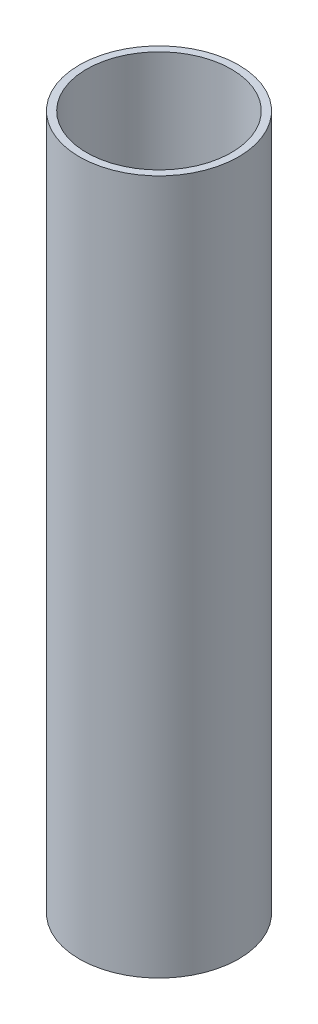
ISO-10303-21;
HEADER;
FILE_DESCRIPTION(('STEP AP214'),'2;1');
FILE_NAME('part.step','',(''),(''),'','','');
FILE_SCHEMA(('AUTOMOTIVE_DESIGN { 1 0 10303 214 1 1 1 1 }'));
ENDSEC;
DATA;
#1=APPLICATION_CONTEXT('core data for automotive mechanical design processes');
#2=APPLICATION_PROTOCOL_DEFINITION('international standard','automotive_design',2000,#1);
#3=PRODUCT_CONTEXT('',#1,'mechanical');
#4=PRODUCT('Part','Part','',(#3));
#5=PRODUCT_RELATED_PRODUCT_CATEGORY('part','',(#4));
#6=PRODUCT_DEFINITION_FORMATION('','',#4);
#7=PRODUCT_DEFINITION_CONTEXT('part definition',#1,'design');
#8=PRODUCT_DEFINITION('design','',#6,#7);
#9=PRODUCT_DEFINITION_SHAPE('','',#8);
#10=(LENGTH_UNIT() NAMED_UNIT(*) SI_UNIT(.MILLI.,.METRE.));
#11=(NAMED_UNIT(*) PLANE_ANGLE_UNIT() SI_UNIT($,.RADIAN.));
#12=(NAMED_UNIT(*) SI_UNIT($,.STERADIAN.) SOLID_ANGLE_UNIT());
#13=UNCERTAINTY_MEASURE_WITH_UNIT(LENGTH_MEASURE(1.E-05),#10,'distance_accuracy_value','');
#14=(GEOMETRIC_REPRESENTATION_CONTEXT(3) GLOBAL_UNCERTAINTY_ASSIGNED_CONTEXT((#13)) GLOBAL_UNIT_ASSIGNED_CONTEXT((#10,
#11,#12)) REPRESENTATION_CONTEXT('',''));
#15=CARTESIAN_POINT('',(0.,0.,0.));
#16=DIRECTION('',(0.,0.,1.));
#17=DIRECTION('',(1.,0.,0.));
#18=AXIS2_PLACEMENT_3D('',#15,#16,#17);
#19=CARTESIAN_POINT('',(0.,152.4,0.));
#20=DIRECTION('',(0.,1.,0.));
#21=DIRECTION('',(0.,0.,1.));
#22=AXIS2_PLACEMENT_3D('',#19,#20,#21);
#23=PLANE('',#22);
#24=CARTESIAN_POINT('',(0.,152.4,0.));
#25=DIRECTION('',(0.,1.,0.));
#26=DIRECTION('',(0.,0.,1.));
#27=AXIS2_PLACEMENT_3D('',#24,#25,#26);
#28=CIRCLE('',#27,17.4625);
#29=CARTESIAN_POINT('',(0.,152.4,-17.4625));
#30=VERTEX_POINT('',#29);
#31=EDGE_CURVE('E10',#30,#30,#28,.T.);
#32=ORIENTED_EDGE('',*,*,#31,.T.);
#33=EDGE_LOOP('',(#32));
#34=FACE_BOUND('',#33,.T.);
#35=CARTESIAN_POINT('',(0.,152.4,0.));
#36=DIRECTION('',(0.,1.,0.));
#37=DIRECTION('',(0.,0.,1.));
#38=AXIS2_PLACEMENT_3D('',#35,#36,#37);
#39=CIRCLE('',#38,15.875);
#40=CARTESIAN_POINT('',(0.,152.4,-15.875));
#41=VERTEX_POINT('',#40);
#42=EDGE_CURVE('E43',#41,#41,#39,.T.);
#43=ORIENTED_EDGE('',*,*,#42,.F.);
#44=EDGE_LOOP('',(#43));
#45=FACE_BOUND('',#44,.T.);
#46=ADVANCED_FACE('F32',(#34,#45),#23,.T.);
#47=CARTESIAN_POINT('',(0.,0.,0.));
#48=DIRECTION('',(0.,1.,0.));
#49=DIRECTION('',(0.,0.,1.));
#50=AXIS2_PLACEMENT_3D('',#47,#48,#49);
#51=PLANE('',#50);
#52=CARTESIAN_POINT('',(0.,0.,0.));
#53=DIRECTION('',(0.,1.,0.));
#54=DIRECTION('',(0.,0.,1.));
#55=AXIS2_PLACEMENT_3D('',#52,#53,#54);
#56=CIRCLE('',#55,17.4625);
#57=CARTESIAN_POINT('',(0.,0.,-17.4625));
#58=VERTEX_POINT('',#57);
#59=EDGE_CURVE('E36',#58,#58,#56,.T.);
#60=ORIENTED_EDGE('',*,*,#59,.F.);
#61=EDGE_LOOP('',(#60));
#62=FACE_BOUND('',#61,.T.);
#63=CARTESIAN_POINT('',(0.,0.,0.));
#64=DIRECTION('',(0.,1.,0.));
#65=DIRECTION('',(0.,0.,1.));
#66=AXIS2_PLACEMENT_3D('',#63,#64,#65);
#67=CIRCLE('',#66,15.875);
#68=CARTESIAN_POINT('',(0.,0.,-15.875));
#69=VERTEX_POINT('',#68);
#70=EDGE_CURVE('E45',#69,#69,#67,.T.);
#71=ORIENTED_EDGE('',*,*,#70,.T.);
#72=EDGE_LOOP('',(#71));
#73=FACE_BOUND('',#72,.T.);
#74=ADVANCED_FACE('F55',(#62,#73),#51,.F.);
#75=CARTESIAN_POINT('',(0.,152.4,0.));
#76=DIRECTION('',(0.,-1.,0.));
#77=DIRECTION('',(0.,0.,-1.));
#78=AXIS2_PLACEMENT_3D('',#75,#76,#77);
#79=CYLINDRICAL_SURFACE('',#78,17.4625);
#80=CARTESIAN_POINT('',(0.,152.4,-17.4625));
#81=CARTESIAN_POINT('',(0.,150.8125,-17.4625));
#82=CARTESIAN_POINT('',(0.,149.225,-17.4625));
#83=CARTESIAN_POINT('',(0.,146.05,-17.4625));
#84=CARTESIAN_POINT('',(0.,144.4625,-17.4625));
#85=CARTESIAN_POINT('',(0.,141.2875,-17.4625));
#86=CARTESIAN_POINT('',(0.,139.7,-17.4625));
#87=CARTESIAN_POINT('',(0.,136.525,-17.4625));
#88=CARTESIAN_POINT('',(0.,134.9375,-17.4625));
#89=CARTESIAN_POINT('',(0.,131.7625,-17.4625));
#90=CARTESIAN_POINT('',(0.,130.175,-17.4625));
#91=CARTESIAN_POINT('',(0.,127.,-17.4625));
#92=CARTESIAN_POINT('',(0.,125.4125,-17.4625));
#93=CARTESIAN_POINT('',(0.,122.2375,-17.4625));
#94=CARTESIAN_POINT('',(0.,120.65,-17.4625));
#95=CARTESIAN_POINT('',(0.,117.475,-17.4625));
#96=CARTESIAN_POINT('',(0.,115.8875,-17.4625));
#97=CARTESIAN_POINT('',(0.,112.7125,-17.4625));
#98=CARTESIAN_POINT('',(0.,111.125,-17.4625));
#99=CARTESIAN_POINT('',(0.,107.95,-17.4625));
#100=CARTESIAN_POINT('',(0.,106.3625,-17.4625));
#101=CARTESIAN_POINT('',(0.,103.1875,-17.4625));
#102=CARTESIAN_POINT('',(0.,101.6,-17.4625));
#103=CARTESIAN_POINT('',(0.,98.425,-17.4625));
#104=CARTESIAN_POINT('',(0.,96.8375,-17.4625));
#105=CARTESIAN_POINT('',(0.,93.6625,-17.4625));
#106=CARTESIAN_POINT('',(0.,92.075,-17.4625));
#107=CARTESIAN_POINT('',(0.,88.9,-17.4625));
#108=CARTESIAN_POINT('',(0.,87.3125,-17.4625));
#109=CARTESIAN_POINT('',(0.,84.1375,-17.4625));
#110=CARTESIAN_POINT('',(0.,82.55,-17.4625));
#111=CARTESIAN_POINT('',(0.,79.375,-17.4625));
#112=CARTESIAN_POINT('',(0.,77.7875,-17.4625));
#113=CARTESIAN_POINT('',(0.,74.6125,-17.4625));
#114=CARTESIAN_POINT('',(0.,73.025,-17.4625));
#115=CARTESIAN_POINT('',(0.,69.85,-17.4625));
#116=CARTESIAN_POINT('',(0.,68.2625,-17.4625));
#117=CARTESIAN_POINT('',(0.,65.0875,-17.4625));
#118=CARTESIAN_POINT('',(0.,63.5,-17.4625));
#119=CARTESIAN_POINT('',(0.,60.325,-17.4625));
#120=CARTESIAN_POINT('',(0.,58.7375,-17.4625));
#121=CARTESIAN_POINT('',(0.,55.5625,-17.4625));
#122=CARTESIAN_POINT('',(0.,53.975,-17.4625));
#123=CARTESIAN_POINT('',(0.,50.8,-17.4625));
#124=CARTESIAN_POINT('',(0.,49.2125,-17.4625));
#125=CARTESIAN_POINT('',(0.,46.0375,-17.4625));
#126=CARTESIAN_POINT('',(0.,44.45,-17.4625));
#127=CARTESIAN_POINT('',(0.,41.275,-17.4625));
#128=CARTESIAN_POINT('',(0.,39.6875,-17.4625));
#129=CARTESIAN_POINT('',(0.,36.5125,-17.4625));
#130=CARTESIAN_POINT('',(0.,34.925,-17.4625));
#131=CARTESIAN_POINT('',(0.,31.75,-17.4625));
#132=CARTESIAN_POINT('',(0.,30.1625,-17.4625));
#133=CARTESIAN_POINT('',(0.,26.9875,-17.4625));
#134=CARTESIAN_POINT('',(0.,25.4,-17.4625));
#135=CARTESIAN_POINT('',(0.,22.225,-17.4625));
#136=CARTESIAN_POINT('',(0.,20.6375,-17.4625));
#137=CARTESIAN_POINT('',(0.,17.4625,-17.4625));
#138=CARTESIAN_POINT('',(0.,15.875,-17.4625));
#139=CARTESIAN_POINT('',(0.,12.7,-17.4625));
#140=CARTESIAN_POINT('',(0.,11.1125,-17.4625));
#141=CARTESIAN_POINT('',(0.,7.93750000000001,-17.4625));
#142=CARTESIAN_POINT('',(0.,6.35,-17.4625));
#143=CARTESIAN_POINT('',(0.,3.175,-17.4625));
#144=CARTESIAN_POINT('',(0.,1.5875,-17.4625));
#145=CARTESIAN_POINT('',(0.,0.,-17.4625));
#146=B_SPLINE_CURVE_WITH_KNOTS('',3,(#80,#81,#82,#83,#84,#85,#86,#87,#88,#89,#90,#91,#92,#93,
#94,#95,#96,#97,#98,#99,#100,#101,#102,#103,#104,#105,#106,#107,#108,#109,#110,#111,#112,#113,
#114,#115,#116,#117,#118,#119,#120,#121,#122,#123,#124,#125,#126,#127,#128,#129,#130,#131,#132,
#133,#134,#135,#136,#137,#138,#139,#140,#141,#142,#143,#144,#145),.UNSPECIFIED.,.F.,.F.,(4,2,2,
2,2,2,2,2,2,2,2,2,2,2,2,2,2,2,2,2,2,2,2,2,2,2,2,2,2,2,2,2,4),(0.,4.76249999999998,
9.52499999999998,14.2875,19.05,23.8125,28.575,33.3375,38.1,42.8625,47.625,52.3875,57.15,61.9125,
66.675,71.4375,76.2,80.9625,85.725,90.4875,95.25,100.0125,104.775,109.5375,114.3,119.0625,
123.825,128.5875,133.35,138.1125,142.875,147.6375,152.4),.UNSPECIFIED.);
#147=EDGE_CURVE('BSEAM34',#30,#58,#146,.T.);
#148=ORIENTED_EDGE('',*,*,#31,.F.);
#149=ORIENTED_EDGE('',*,*,#59,.T.);
#150=ORIENTED_EDGE('',*,*,#147,.T.);
#151=ORIENTED_EDGE('',*,*,#147,.F.);
#152=EDGE_LOOP('',(#148,#150,#149,#151));
#153=FACE_BOUND('',#152,.T.);
#154=ADVANCED_FACE('F34',(#153),#79,.T.);
#155=CARTESIAN_POINT('',(0.,152.4,0.));
#156=DIRECTION('',(0.,-1.,0.));
#157=DIRECTION('',(0.,0.,-1.));
#158=AXIS2_PLACEMENT_3D('',#155,#156,#157);
#159=CYLINDRICAL_SURFACE('',#158,15.875);
#160=CARTESIAN_POINT('',(0.,152.4,-15.875));
#161=CARTESIAN_POINT('',(0.,150.8125,-15.875));
#162=CARTESIAN_POINT('',(0.,149.225,-15.875));
#163=CARTESIAN_POINT('',(0.,146.05,-15.875));
#164=CARTESIAN_POINT('',(0.,144.4625,-15.875));
#165=CARTESIAN_POINT('',(0.,141.2875,-15.875));
#166=CARTESIAN_POINT('',(0.,139.7,-15.875));
#167=CARTESIAN_POINT('',(0.,136.525,-15.875));
#168=CARTESIAN_POINT('',(0.,134.9375,-15.875));
#169=CARTESIAN_POINT('',(0.,131.7625,-15.875));
#170=CARTESIAN_POINT('',(0.,130.175,-15.875));
#171=CARTESIAN_POINT('',(0.,127.,-15.875));
#172=CARTESIAN_POINT('',(0.,125.4125,-15.875));
#173=CARTESIAN_POINT('',(0.,122.2375,-15.875));
#174=CARTESIAN_POINT('',(0.,120.65,-15.875));
#175=CARTESIAN_POINT('',(0.,117.475,-15.875));
#176=CARTESIAN_POINT('',(0.,115.8875,-15.875));
#177=CARTESIAN_POINT('',(0.,112.7125,-15.875));
#178=CARTESIAN_POINT('',(0.,111.125,-15.875));
#179=CARTESIAN_POINT('',(0.,107.95,-15.875));
#180=CARTESIAN_POINT('',(0.,106.3625,-15.875));
#181=CARTESIAN_POINT('',(0.,103.1875,-15.875));
#182=CARTESIAN_POINT('',(0.,101.6,-15.875));
#183=CARTESIAN_POINT('',(0.,98.425,-15.875));
#184=CARTESIAN_POINT('',(0.,96.8375,-15.875));
#185=CARTESIAN_POINT('',(0.,93.6625,-15.875));
#186=CARTESIAN_POINT('',(0.,92.075,-15.875));
#187=CARTESIAN_POINT('',(0.,88.9,-15.875));
#188=CARTESIAN_POINT('',(0.,87.3125,-15.875));
#189=CARTESIAN_POINT('',(0.,84.1375,-15.875));
#190=CARTESIAN_POINT('',(0.,82.55,-15.875));
#191=CARTESIAN_POINT('',(0.,79.375,-15.875));
#192=CARTESIAN_POINT('',(0.,77.7875,-15.875));
#193=CARTESIAN_POINT('',(0.,74.6125,-15.875));
#194=CARTESIAN_POINT('',(0.,73.025,-15.875));
#195=CARTESIAN_POINT('',(0.,69.85,-15.875));
#196=CARTESIAN_POINT('',(0.,68.2625,-15.875));
#197=CARTESIAN_POINT('',(0.,65.0875,-15.875));
#198=CARTESIAN_POINT('',(0.,63.5,-15.875));
#199=CARTESIAN_POINT('',(0.,60.325,-15.875));
#200=CARTESIAN_POINT('',(0.,58.7375,-15.875));
#201=CARTESIAN_POINT('',(0.,55.5625,-15.875));
#202=CARTESIAN_POINT('',(0.,53.975,-15.875));
#203=CARTESIAN_POINT('',(0.,50.8,-15.875));
#204=CARTESIAN_POINT('',(0.,49.2125,-15.875));
#205=CARTESIAN_POINT('',(0.,46.0375,-15.875));
#206=CARTESIAN_POINT('',(0.,44.45,-15.875));
#207=CARTESIAN_POINT('',(0.,41.275,-15.875));
#208=CARTESIAN_POINT('',(0.,39.6875,-15.875));
#209=CARTESIAN_POINT('',(0.,36.5125,-15.875));
#210=CARTESIAN_POINT('',(0.,34.925,-15.875));
#211=CARTESIAN_POINT('',(0.,31.75,-15.875));
#212=CARTESIAN_POINT('',(0.,30.1625,-15.875));
#213=CARTESIAN_POINT('',(0.,26.9875,-15.875));
#214=CARTESIAN_POINT('',(0.,25.4,-15.875));
#215=CARTESIAN_POINT('',(0.,22.225,-15.875));
#216=CARTESIAN_POINT('',(0.,20.6375,-15.875));
#217=CARTESIAN_POINT('',(0.,17.4625,-15.875));
#218=CARTESIAN_POINT('',(0.,15.875,-15.875));
#219=CARTESIAN_POINT('',(0.,12.7,-15.875));
#220=CARTESIAN_POINT('',(0.,11.1125,-15.875));
#221=CARTESIAN_POINT('',(0.,7.93750000000001,-15.875));
#222=CARTESIAN_POINT('',(0.,6.35,-15.875));
#223=CARTESIAN_POINT('',(0.,3.175,-15.875));
#224=CARTESIAN_POINT('',(0.,1.5875,-15.875));
#225=CARTESIAN_POINT('',(0.,0.,-15.875));
#226=B_SPLINE_CURVE_WITH_KNOTS('',3,(#160,#161,#162,#163,#164,#165,#166,#167,#168,#169,#170,
#171,#172,#173,#174,#175,#176,#177,#178,#179,#180,#181,#182,#183,#184,#185,#186,#187,#188,#189,
#190,#191,#192,#193,#194,#195,#196,#197,#198,#199,#200,#201,#202,#203,#204,#205,#206,#207,#208,
#209,#210,#211,#212,#213,#214,#215,#216,#217,#218,#219,#220,#221,#222,#223,#224,#225),
.UNSPECIFIED.,.F.,.F.,(4,2,2,2,2,2,2,2,2,2,2,2,2,2,2,2,2,2,2,2,2,2,2,2,2,2,2,2,2,2,2,2,4),(0.,
4.76249999999998,9.52499999999998,14.2875,19.05,23.8125,28.575,33.3375,38.1,42.8625,47.625,
52.3875,57.15,61.9125,66.675,71.4375,76.2,80.9625,85.725,90.4875,95.25,100.0125,104.775,
109.5375,114.3,119.0625,123.825,128.5875,133.35,138.1125,142.875,147.6375,152.4),.UNSPECIFIED.);
#227=EDGE_CURVE('BSEAM51',#41,#69,#226,.T.);
#228=ORIENTED_EDGE('',*,*,#42,.T.);
#229=ORIENTED_EDGE('',*,*,#70,.F.);
#230=ORIENTED_EDGE('',*,*,#227,.T.);
#231=ORIENTED_EDGE('',*,*,#227,.F.);
#232=EDGE_LOOP('',(#228,#230,#229,#231));
#233=FACE_BOUND('',#232,.T.);
#234=ADVANCED_FACE('F51',(#233),#159,.F.);
#235=CLOSED_SHELL('',(#46,#74,#154,#234));
#236=MANIFOLD_SOLID_BREP('B2',#235);
#237=ADVANCED_BREP_SHAPE_REPRESENTATION('',(#18,#236),#14);
#238=SHAPE_DEFINITION_REPRESENTATION(#9,#237);
ENDSEC;
END-ISO-10303-21;
